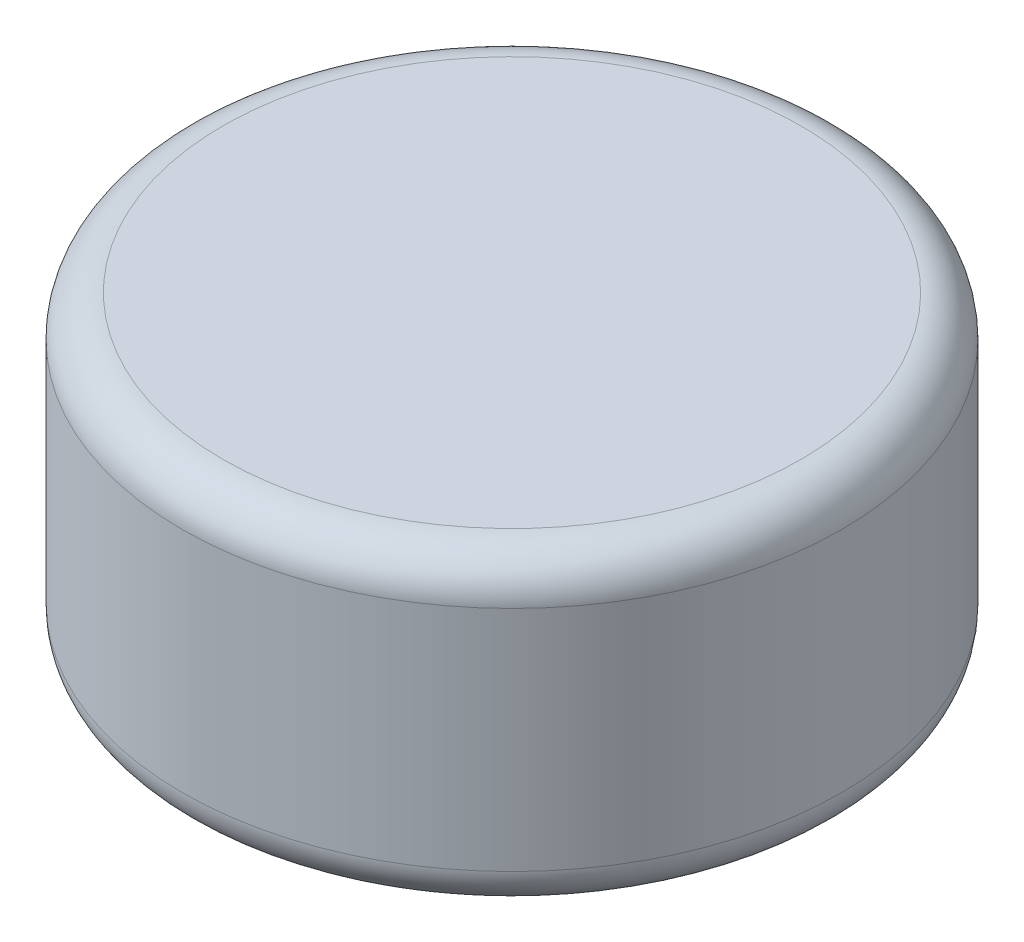
ISO-10303-21;
HEADER;
FILE_DESCRIPTION(('STEP AP214'),'2;1');
FILE_NAME('part.step','',(''),(''),'','','');
FILE_SCHEMA(('AUTOMOTIVE_DESIGN { 1 0 10303 214 1 1 1 1 }'));
ENDSEC;
DATA;
#1=APPLICATION_CONTEXT('core data for automotive mechanical design processes');
#2=APPLICATION_PROTOCOL_DEFINITION('international standard','automotive_design',2000,#1);
#3=PRODUCT_CONTEXT('',#1,'mechanical');
#4=PRODUCT('Part','Part','',(#3));
#5=PRODUCT_RELATED_PRODUCT_CATEGORY('part','',(#4));
#6=PRODUCT_DEFINITION_FORMATION('','',#4);
#7=PRODUCT_DEFINITION_CONTEXT('part definition',#1,'design');
#8=PRODUCT_DEFINITION('design','',#6,#7);
#9=PRODUCT_DEFINITION_SHAPE('','',#8);
#10=(LENGTH_UNIT() NAMED_UNIT(*) SI_UNIT(.MILLI.,.METRE.));
#11=(NAMED_UNIT(*) PLANE_ANGLE_UNIT() SI_UNIT($,.RADIAN.));
#12=(NAMED_UNIT(*) SI_UNIT($,.STERADIAN.) SOLID_ANGLE_UNIT());
#13=UNCERTAINTY_MEASURE_WITH_UNIT(LENGTH_MEASURE(1.E-05),#10,'distance_accuracy_value','');
#14=(GEOMETRIC_REPRESENTATION_CONTEXT(3) GLOBAL_UNCERTAINTY_ASSIGNED_CONTEXT((#13)) GLOBAL_UNIT_ASSIGNED_CONTEXT((#10,
#11,#12)) REPRESENTATION_CONTEXT('',''));
#15=CARTESIAN_POINT('',(0.,0.,0.));
#16=DIRECTION('',(0.,0.,1.));
#17=DIRECTION('',(1.,0.,0.));
#18=AXIS2_PLACEMENT_3D('',#15,#16,#17);
#19=CARTESIAN_POINT('',(0.,38.100000066,0.));
#20=DIRECTION('',(0.,-1.,0.));
#21=DIRECTION('',(0.,0.,-1.));
#22=AXIS2_PLACEMENT_3D('',#19,#20,#21);
#23=CYLINDRICAL_SURFACE('',#22,40.64);
#24=CARTESIAN_POINT('',(0.,5.,0.));
#25=DIRECTION('',(0.,1.,0.));
#26=DIRECTION('',(0.,0.,1.));
#27=AXIS2_PLACEMENT_3D('',#24,#25,#26);
#28=CIRCLE('',#27,40.64);
#29=CARTESIAN_POINT('',(0.,4.99999999999999,-40.64));
#30=VERTEX_POINT('',#29);
#31=EDGE_CURVE('E53',#30,#30,#28,.T.);
#32=CARTESIAN_POINT('',(0.,33.100000066,0.));
#33=DIRECTION('',(0.,1.,0.));
#34=DIRECTION('',(0.,0.,1.));
#35=AXIS2_PLACEMENT_3D('',#32,#33,#34);
#36=CIRCLE('',#35,40.64);
#37=CARTESIAN_POINT('',(0.,33.100000066,-40.64));
#38=VERTEX_POINT('',#37);
#39=EDGE_CURVE('E57',#38,#38,#36,.F.);
#40=CARTESIAN_POINT('',(0.,4.99999999999999,-40.64));
#41=CARTESIAN_POINT('',(0.,5.29270833402082,-40.64));
#42=CARTESIAN_POINT('',(0.,5.58541666804166,-40.64));
#43=CARTESIAN_POINT('',(0.,6.17083333608333,-40.64));
#44=CARTESIAN_POINT('',(0.,6.46354167010416,-40.64));
#45=CARTESIAN_POINT('',(0.,7.04895833814582,-40.64));
#46=CARTESIAN_POINT('',(0.,7.34166667216665,-40.64));
#47=CARTESIAN_POINT('',(0.,7.92708334020832,-40.64));
#48=CARTESIAN_POINT('',(0.,8.21979167422915,-40.64));
#49=CARTESIAN_POINT('',(0.,8.80520834227082,-40.64));
#50=CARTESIAN_POINT('',(0.,9.09791667629166,-40.64));
#51=CARTESIAN_POINT('',(0.,9.68333334433332,-40.64));
#52=CARTESIAN_POINT('',(0.,9.97604167835416,-40.64));
#53=CARTESIAN_POINT('',(0.,10.5614583463958,-40.64));
#54=CARTESIAN_POINT('',(0.,10.8541666804167,-40.64));
#55=CARTESIAN_POINT('',(0.,11.4395833484583,-40.64));
#56=CARTESIAN_POINT('',(0.,11.7322916824792,-40.64));
#57=CARTESIAN_POINT('',(0.,12.3177083505208,-40.64));
#58=CARTESIAN_POINT('',(0.,12.6104166845417,-40.64));
#59=CARTESIAN_POINT('',(0.,13.1958333525833,-40.64));
#60=CARTESIAN_POINT('',(0.,13.4885416866042,-40.64));
#61=CARTESIAN_POINT('',(0.,14.0739583546458,-40.64));
#62=CARTESIAN_POINT('',(0.,14.3666666886667,-40.64));
#63=CARTESIAN_POINT('',(0.,14.9520833567083,-40.64));
#64=CARTESIAN_POINT('',(0.,15.2447916907292,-40.64));
#65=CARTESIAN_POINT('',(0.,15.8302083587708,-40.64));
#66=CARTESIAN_POINT('',(0.,16.1229166927917,-40.64));
#67=CARTESIAN_POINT('',(0.,16.7083333608333,-40.64));
#68=CARTESIAN_POINT('',(0.,17.0010416948542,-40.64));
#69=CARTESIAN_POINT('',(0.,17.5864583628958,-40.64));
#70=CARTESIAN_POINT('',(0.,17.8791666969167,-40.64));
#71=CARTESIAN_POINT('',(0.,18.4645833649583,-40.64));
#72=CARTESIAN_POINT('',(0.,18.7572916989792,-40.64));
#73=CARTESIAN_POINT('',(0.,19.3427083670208,-40.64));
#74=CARTESIAN_POINT('',(0.,19.6354167010417,-40.64));
#75=CARTESIAN_POINT('',(0.,20.2208333690833,-40.64));
#76=CARTESIAN_POINT('',(0.,20.5135417031042,-40.64));
#77=CARTESIAN_POINT('',(0.,21.0989583711458,-40.64));
#78=CARTESIAN_POINT('',(0.,21.3916667051667,-40.64));
#79=CARTESIAN_POINT('',(0.,21.9770833732083,-40.64));
#80=CARTESIAN_POINT('',(0.,22.2697917072292,-40.64));
#81=CARTESIAN_POINT('',(0.,22.8552083752708,-40.64));
#82=CARTESIAN_POINT('',(0.,23.1479167092917,-40.64));
#83=CARTESIAN_POINT('',(0.,23.7333333773333,-40.64));
#84=CARTESIAN_POINT('',(0.,24.0260417113542,-40.64));
#85=CARTESIAN_POINT('',(0.,24.6114583793958,-40.64));
#86=CARTESIAN_POINT('',(0.,24.9041667134167,-40.64));
#87=CARTESIAN_POINT('',(0.,25.4895833814583,-40.64));
#88=CARTESIAN_POINT('',(0.,25.7822917154792,-40.64));
#89=CARTESIAN_POINT('',(0.,26.3677083835208,-40.64));
#90=CARTESIAN_POINT('',(0.,26.6604167175417,-40.64));
#91=CARTESIAN_POINT('',(0.,27.2458333855833,-40.64));
#92=CARTESIAN_POINT('',(0.,27.5385417196042,-40.64));
#93=CARTESIAN_POINT('',(0.,28.1239583876458,-40.64));
#94=CARTESIAN_POINT('',(0.,28.4166667216667,-40.64));
#95=CARTESIAN_POINT('',(0.,29.0020833897083,-40.64));
#96=CARTESIAN_POINT('',(0.,29.2947917237292,-40.64));
#97=CARTESIAN_POINT('',(0.,29.8802083917708,-40.64));
#98=CARTESIAN_POINT('',(0.,30.1729167257917,-40.64));
#99=CARTESIAN_POINT('',(0.,30.7583333938333,-40.64));
#100=CARTESIAN_POINT('',(0.,31.0510417278542,-40.64));
#101=CARTESIAN_POINT('',(0.,31.6364583958958,-40.64));
#102=CARTESIAN_POINT('',(0.,31.9291667299167,-40.64));
#103=CARTESIAN_POINT('',(0.,32.5145833979583,-40.64));
#104=CARTESIAN_POINT('',(0.,32.8072917319792,-40.64));
#105=CARTESIAN_POINT('',(0.,33.100000066,-40.64));
#106=B_SPLINE_CURVE_WITH_KNOTS('',3,(#40,#41,#42,#43,#44,#45,#46,#47,#48,#49,#50,#51,#52,#53,
#54,#55,#56,#57,#58,#59,#60,#61,#62,#63,#64,#65,#66,#67,#68,#69,#70,#71,#72,#73,#74,#75,#76,#77,
#78,#79,#80,#81,#82,#83,#84,#85,#86,#87,#88,#89,#90,#91,#92,#93,#94,#95,#96,#97,#98,#99,#100,
#101,#102,#103,#104,#105),.UNSPECIFIED.,.F.,.F.,(4,2,2,2,2,2,2,2,2,2,2,2,2,2,2,2,2,2,2,2,2,2,2,
2,2,2,2,2,2,2,2,2,4),(0.,0.878125002062503,1.756250004125,2.6343750061875,3.51250000825,
4.3906250103125,5.268750012375,6.1468750144375,7.0250000165,7.9031250185625,8.781250020625,
9.6593750226875,10.53750002475,11.4156250268125,12.293750028875,13.1718750309375,14.050000033,
14.9281250350625,15.806250037125,16.6843750391875,17.56250004125,18.4406250433125,
19.318750045375,20.1968750474375,21.0750000495,21.9531250515625,22.831250053625,
23.7093750556875,24.58750005775,25.4656250598125,26.343750061875,27.2218750639375,28.100000066),.UNSPECIFIED.);
#107=EDGE_CURVE('BSEAM42',#30,#38,#106,.T.);
#108=ORIENTED_EDGE('',*,*,#31,.T.);
#109=ORIENTED_EDGE('',*,*,#39,.T.);
#110=ORIENTED_EDGE('',*,*,#107,.T.);
#111=ORIENTED_EDGE('',*,*,#107,.F.);
#112=EDGE_LOOP('',(#108,#110,#109,#111));
#113=FACE_BOUND('',#112,.T.);
#114=ADVANCED_FACE('F42',(#113),#23,.T.);
#115=CARTESIAN_POINT('',(0.,38.100000066,0.));
#116=DIRECTION('',(0.,1.,0.));
#117=DIRECTION('',(0.,0.,1.));
#118=AXIS2_PLACEMENT_3D('',#115,#116,#117);
#119=PLANE('',#118);
#120=CARTESIAN_POINT('',(0.,38.100000066,0.));
#121=DIRECTION('',(0.,1.,0.));
#122=DIRECTION('',(0.,0.,1.));
#123=AXIS2_PLACEMENT_3D('',#120,#121,#122);
#124=CIRCLE('',#123,35.64);
#125=CARTESIAN_POINT('',(0.,38.100000066,35.64));
#126=VERTEX_POINT('',#125);
#127=EDGE_CURVE('E10',#126,#126,#124,.T.);
#128=ORIENTED_EDGE('',*,*,#127,.T.);
#129=EDGE_LOOP('',(#128));
#130=FACE_BOUND('',#129,.T.);
#131=ADVANCED_FACE('F80',(#130),#119,.T.);
#132=CARTESIAN_POINT('',(0.,0.,0.));
#133=DIRECTION('',(0.,1.,0.));
#134=DIRECTION('',(0.,0.,1.));
#135=AXIS2_PLACEMENT_3D('',#132,#133,#134);
#136=PLANE('',#135);
#137=CARTESIAN_POINT('',(1.58700101448983,0.,-0.118729115276661));
#138=DIRECTION('',(0.,-1.,0.));
#139=DIRECTION('',(0.,0.,-1.));
#140=AXIS2_PLACEMENT_3D('',#137,#138,#139);
#141=CIRCLE('',#140,3.17500000000528);
#142=CARTESIAN_POINT('',(1.58700101448983,0.,-3.29372911528194));
#143=VERTEX_POINT('',#142);
#144=EDGE_CURVE('E63',#143,#143,#141,.T.);
#145=ORIENTED_EDGE('',*,*,#144,.F.);
#146=EDGE_LOOP('',(#145));
#147=FACE_BOUND('',#146,.T.);
#148=CARTESIAN_POINT('',(0.,0.,0.));
#149=DIRECTION('',(0.,1.,0.));
#150=DIRECTION('',(0.,0.,1.));
#151=AXIS2_PLACEMENT_3D('',#148,#149,#150);
#152=CIRCLE('',#151,35.64);
#153=CARTESIAN_POINT('',(0.,0.,35.64));
#154=VERTEX_POINT('',#153);
#155=EDGE_CURVE('E49',#154,#154,#152,.F.);
#156=ORIENTED_EDGE('',*,*,#155,.T.);
#157=EDGE_LOOP('',(#156));
#158=FACE_BOUND('',#157,.T.);
#159=ADVANCED_FACE('F77',(#147,#158),#136,.F.);
#160=CARTESIAN_POINT('',(0.,5.,0.));
#161=DIRECTION('',(0.,1.,0.));
#162=DIRECTION('',(0.,0.,1.));
#163=AXIS2_PLACEMENT_3D('',#160,#161,#162);
#164=TOROIDAL_SURFACE('',#163,35.64,5.);
#165=ORIENTED_EDGE('',*,*,#155,.F.);
#166=EDGE_LOOP('',(#165));
#167=FACE_BOUND('',#166,.T.);
#168=ORIENTED_EDGE('',*,*,#31,.F.);
#169=EDGE_LOOP('',(#168));
#170=FACE_BOUND('',#169,.T.);
#171=ADVANCED_FACE('F79',(#167,#170),#164,.T.);
#172=CARTESIAN_POINT('',(0.,33.100000066,0.));
#173=DIRECTION('',(0.,1.,0.));
#174=DIRECTION('',(0.,0.,1.));
#175=AXIS2_PLACEMENT_3D('',#172,#173,#174);
#176=TOROIDAL_SURFACE('',#175,35.64,5.);
#177=ORIENTED_EDGE('',*,*,#39,.F.);
#178=EDGE_LOOP('',(#177));
#179=FACE_BOUND('',#178,.T.);
#180=ORIENTED_EDGE('',*,*,#127,.F.);
#181=EDGE_LOOP('',(#180));
#182=FACE_BOUND('',#181,.T.);
#183=ADVANCED_FACE('F44',(#179,#182),#176,.T.);
#184=CARTESIAN_POINT('',(1.58700101448983,25.4,-0.118729115276661));
#185=DIRECTION('',(0.,-1.,0.));
#186=DIRECTION('',(0.,0.,-1.));
#187=AXIS2_PLACEMENT_3D('',#184,#185,#186);
#188=CYLINDRICAL_SURFACE('',#187,3.17500000000528);
#189=CARTESIAN_POINT('',(1.58700101448983,25.4,-0.118729115276661));
#190=DIRECTION('',(0.,-1.,0.));
#191=DIRECTION('',(0.,0.,-1.));
#192=AXIS2_PLACEMENT_3D('',#189,#190,#191);
#193=CIRCLE('',#192,3.17500000000528);
#194=CARTESIAN_POINT('',(1.58700101448983,25.4,-3.29372911528194));
#195=VERTEX_POINT('',#194);
#196=EDGE_CURVE('E62',#195,#195,#193,.T.);
#197=ORIENTED_EDGE('',*,*,#196,.F.);
#198=EDGE_LOOP('',(#197));
#199=FACE_BOUND('',#198,.T.);
#200=ORIENTED_EDGE('',*,*,#144,.T.);
#201=EDGE_LOOP('',(#200));
#202=FACE_BOUND('',#201,.T.);
#203=ADVANCED_FACE('F71',(#199,#202),#188,.F.);
#204=CARTESIAN_POINT('',(1.58700101448983,25.4,-0.118729115276661));
#205=DIRECTION('',(0.,-1.,0.));
#206=DIRECTION('',(0.,0.,-1.));
#207=AXIS2_PLACEMENT_3D('',#204,#205,#206);
#208=PLANE('',#207);
#209=ORIENTED_EDGE('',*,*,#196,.T.);
#210=EDGE_LOOP('',(#209));
#211=FACE_BOUND('',#210,.T.);
#212=ADVANCED_FACE('F69',(#211),#208,.T.);
#213=CLOSED_SHELL('',(#114,#131,#159,#171,#183,#203,#212));
#214=MANIFOLD_SOLID_BREP('B2',#213);
#215=ADVANCED_BREP_SHAPE_REPRESENTATION('',(#18,#214),#14);
#216=SHAPE_DEFINITION_REPRESENTATION(#9,#215);
ENDSEC;
END-ISO-10303-21;
